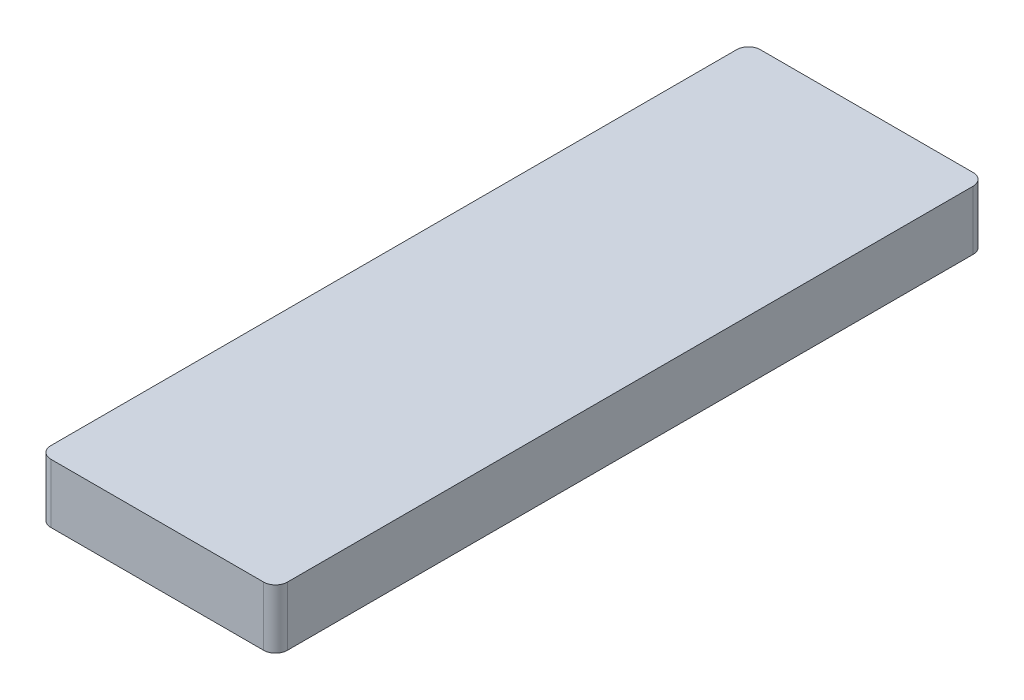
ISO-10303-21;
HEADER;
FILE_DESCRIPTION(('STEP AP214'),'2;1');
FILE_NAME('part.step','',(''),(''),'','','');
FILE_SCHEMA(('AUTOMOTIVE_DESIGN { 1 0 10303 214 1 1 1 1 }'));
ENDSEC;
DATA;
#1=APPLICATION_CONTEXT('core data for automotive mechanical design processes');
#2=APPLICATION_PROTOCOL_DEFINITION('international standard','automotive_design',2000,#1);
#3=PRODUCT_CONTEXT('',#1,'mechanical');
#4=PRODUCT('Part','Part','',(#3));
#5=PRODUCT_RELATED_PRODUCT_CATEGORY('part','',(#4));
#6=PRODUCT_DEFINITION_FORMATION('','',#4);
#7=PRODUCT_DEFINITION_CONTEXT('part definition',#1,'design');
#8=PRODUCT_DEFINITION('design','',#6,#7);
#9=PRODUCT_DEFINITION_SHAPE('','',#8);
#10=(LENGTH_UNIT() NAMED_UNIT(*) SI_UNIT(.MILLI.,.METRE.));
#11=(NAMED_UNIT(*) PLANE_ANGLE_UNIT() SI_UNIT($,.RADIAN.));
#12=(NAMED_UNIT(*) SI_UNIT($,.STERADIAN.) SOLID_ANGLE_UNIT());
#13=UNCERTAINTY_MEASURE_WITH_UNIT(LENGTH_MEASURE(1.E-05),#10,'distance_accuracy_value','');
#14=(GEOMETRIC_REPRESENTATION_CONTEXT(3) GLOBAL_UNCERTAINTY_ASSIGNED_CONTEXT((#13)) GLOBAL_UNIT_ASSIGNED_CONTEXT((#10,
#11,#12)) REPRESENTATION_CONTEXT('',''));
#15=CARTESIAN_POINT('',(0.,0.,0.));
#16=DIRECTION('',(0.,0.,1.));
#17=DIRECTION('',(1.,0.,0.));
#18=AXIS2_PLACEMENT_3D('',#15,#16,#17);
#19=CARTESIAN_POINT('',(48.26,12.7,-2.54));
#20=DIRECTION('',(0.,-1.,0.));
#21=DIRECTION('',(0.,0.,-1.));
#22=AXIS2_PLACEMENT_3D('',#19,#20,#21);
#23=CYLINDRICAL_SURFACE('',#22,2.54);
#24=CARTESIAN_POINT('',(48.26,0.,-2.54));
#25=DIRECTION('',(0.,1.,0.));
#26=DIRECTION('',(0.,0.,-1.));
#27=AXIS2_PLACEMENT_3D('',#24,#25,#26);
#28=CIRCLE('',#27,2.54);
#29=CARTESIAN_POINT('',(48.26,0.,0.));
#30=VERTEX_POINT('',#29);
#31=CARTESIAN_POINT('',(50.8,0.,-2.54000000000002));
#32=VERTEX_POINT('',#31);
#33=EDGE_CURVE('E129',#30,#32,#28,.T.);
#34=ORIENTED_EDGE('',*,*,#33,.T.);
#35=DIRECTION('',(0.,-1.,0.));
#36=VECTOR('',#35,1.);
#37=CARTESIAN_POINT('',(50.8,12.7,-2.54000000000002));
#38=LINE('',#37,#36);
#39=CARTESIAN_POINT('',(50.8,12.7,-2.54000000000002));
#40=VERTEX_POINT('',#39);
#41=EDGE_CURVE('E11',#40,#32,#38,.T.);
#42=ORIENTED_EDGE('',*,*,#41,.F.);
#43=CARTESIAN_POINT('',(48.26,12.7,-2.54));
#44=DIRECTION('',(0.,1.,0.));
#45=DIRECTION('',(0.,0.,-1.));
#46=AXIS2_PLACEMENT_3D('',#43,#44,#45);
#47=CIRCLE('',#46,2.54);
#48=CARTESIAN_POINT('',(48.26,12.7,0.));
#49=VERTEX_POINT('',#48);
#50=EDGE_CURVE('E143',#49,#40,#47,.T.);
#51=ORIENTED_EDGE('',*,*,#50,.F.);
#52=DIRECTION('',(0.,-1.,0.));
#53=VECTOR('',#52,1.);
#54=CARTESIAN_POINT('',(48.26,12.7,0.));
#55=LINE('',#54,#53);
#56=EDGE_CURVE('E125',#49,#30,#55,.T.);
#57=ORIENTED_EDGE('',*,*,#56,.T.);
#58=EDGE_LOOP('',(#34,#42,#51,#57));
#59=FACE_BOUND('',#58,.T.);
#60=ADVANCED_FACE('F33',(#59),#23,.T.);
#61=CARTESIAN_POINT('',(50.8,12.7,-2.54000000000002));
#62=DIRECTION('',(-1.,0.,0.));
#63=DIRECTION('',(0.,0.,1.));
#64=AXIS2_PLACEMENT_3D('',#61,#62,#63);
#65=PLANE('',#64);
#66=DIRECTION('',(0.,0.,-1.));
#67=VECTOR('',#66,1.);
#68=CARTESIAN_POINT('',(50.8,0.,-2.54000000000002));
#69=LINE('',#68,#67);
#70=CARTESIAN_POINT('',(50.8,0.,-149.86));
#71=VERTEX_POINT('',#70);
#72=EDGE_CURVE('E132',#32,#71,#69,.T.);
#73=ORIENTED_EDGE('',*,*,#72,.T.);
#74=DIRECTION('',(0.,-1.,0.));
#75=VECTOR('',#74,1.);
#76=CARTESIAN_POINT('',(50.8,12.7,-149.86));
#77=LINE('',#76,#75);
#78=CARTESIAN_POINT('',(50.8,12.7,-149.86));
#79=VERTEX_POINT('',#78);
#80=EDGE_CURVE('E41',#79,#71,#77,.T.);
#81=ORIENTED_EDGE('',*,*,#80,.F.);
#82=DIRECTION('',(0.,0.,-1.));
#83=VECTOR('',#82,1.);
#84=CARTESIAN_POINT('',(50.8,12.7,-2.54000000000002));
#85=LINE('',#84,#83);
#86=EDGE_CURVE('E92',#40,#79,#85,.T.);
#87=ORIENTED_EDGE('',*,*,#86,.F.);
#88=ORIENTED_EDGE('',*,*,#41,.T.);
#89=EDGE_LOOP('',(#73,#81,#87,#88));
#90=FACE_BOUND('',#89,.T.);
#91=ADVANCED_FACE('F178',(#90),#65,.F.);
#92=CARTESIAN_POINT('',(48.26,12.7,-149.86));
#93=DIRECTION('',(0.,-1.,0.));
#94=DIRECTION('',(0.,0.,-1.));
#95=AXIS2_PLACEMENT_3D('',#92,#93,#94);
#96=CYLINDRICAL_SURFACE('',#95,2.53999999999999);
#97=CARTESIAN_POINT('',(48.26,0.,-149.86));
#98=DIRECTION('',(0.,1.,0.));
#99=DIRECTION('',(0.,0.,1.));
#100=AXIS2_PLACEMENT_3D('',#97,#98,#99);
#101=CIRCLE('',#100,2.53999999999999);
#102=CARTESIAN_POINT('',(48.26,0.,-152.4));
#103=VERTEX_POINT('',#102);
#104=EDGE_CURVE('E134',#71,#103,#101,.T.);
#105=ORIENTED_EDGE('',*,*,#104,.T.);
#106=DIRECTION('',(0.,-1.,0.));
#107=VECTOR('',#106,1.);
#108=CARTESIAN_POINT('',(48.26,12.7,-152.4));
#109=LINE('',#108,#107);
#110=CARTESIAN_POINT('',(48.26,12.7,-152.4));
#111=VERTEX_POINT('',#110);
#112=EDGE_CURVE('E150',#111,#103,#109,.T.);
#113=ORIENTED_EDGE('',*,*,#112,.F.);
#114=CARTESIAN_POINT('',(48.26,12.7,-149.86));
#115=DIRECTION('',(0.,1.,0.));
#116=DIRECTION('',(0.,0.,1.));
#117=AXIS2_PLACEMENT_3D('',#114,#115,#116);
#118=CIRCLE('',#117,2.53999999999999);
#119=EDGE_CURVE('E158',#79,#111,#118,.T.);
#120=ORIENTED_EDGE('',*,*,#119,.F.);
#121=ORIENTED_EDGE('',*,*,#80,.T.);
#122=EDGE_LOOP('',(#105,#113,#120,#121));
#123=FACE_BOUND('',#122,.T.);
#124=ADVANCED_FACE('F156',(#123),#96,.T.);
#125=CARTESIAN_POINT('',(2.54000000000002,12.7,-152.4));
#126=DIRECTION('',(0.,0.,1.));
#127=DIRECTION('',(1.,0.,0.));
#128=AXIS2_PLACEMENT_3D('',#125,#126,#127);
#129=PLANE('',#128);
#130=DIRECTION('',(-1.,0.,0.));
#131=VECTOR('',#130,1.);
#132=CARTESIAN_POINT('',(2.54000000000002,0.,-152.4));
#133=LINE('',#132,#131);
#134=CARTESIAN_POINT('',(2.54000000000002,0.,-152.4));
#135=VERTEX_POINT('',#134);
#136=EDGE_CURVE('E136',#103,#135,#133,.T.);
#137=ORIENTED_EDGE('',*,*,#136,.T.);
#138=DIRECTION('',(0.,-1.,0.));
#139=VECTOR('',#138,1.);
#140=CARTESIAN_POINT('',(2.54000000000002,12.7,-152.4));
#141=LINE('',#140,#139);
#142=CARTESIAN_POINT('',(2.54000000000002,12.7,-152.4));
#143=VERTEX_POINT('',#142);
#144=EDGE_CURVE('E147',#143,#135,#141,.T.);
#145=ORIENTED_EDGE('',*,*,#144,.F.);
#146=DIRECTION('',(-1.,0.,0.));
#147=VECTOR('',#146,1.);
#148=CARTESIAN_POINT('',(2.54000000000002,12.7,-152.4));
#149=LINE('',#148,#147);
#150=EDGE_CURVE('E170',#111,#143,#149,.T.);
#151=ORIENTED_EDGE('',*,*,#150,.F.);
#152=ORIENTED_EDGE('',*,*,#112,.T.);
#153=EDGE_LOOP('',(#137,#145,#151,#152));
#154=FACE_BOUND('',#153,.T.);
#155=ADVANCED_FACE('F166',(#154),#129,.F.);
#156=CARTESIAN_POINT('',(2.54,12.7,-149.86));
#157=DIRECTION('',(0.,-1.,0.));
#158=DIRECTION('',(0.,0.,-1.));
#159=AXIS2_PLACEMENT_3D('',#156,#157,#158);
#160=CYLINDRICAL_SURFACE('',#159,2.53999999999999);
#161=CARTESIAN_POINT('',(2.54,0.,-149.86));
#162=DIRECTION('',(0.,1.,0.));
#163=DIRECTION('',(0.,0.,1.));
#164=AXIS2_PLACEMENT_3D('',#161,#162,#163);
#165=CIRCLE('',#164,2.53999999999999);
#166=CARTESIAN_POINT('',(0.,0.,-149.86));
#167=VERTEX_POINT('',#166);
#168=EDGE_CURVE('E138',#135,#167,#165,.T.);
#169=ORIENTED_EDGE('',*,*,#168,.T.);
#170=DIRECTION('',(0.,-1.,0.));
#171=VECTOR('',#170,1.);
#172=CARTESIAN_POINT('',(0.,12.7,-149.86));
#173=LINE('',#172,#171);
#174=CARTESIAN_POINT('',(0.,12.7,-149.86));
#175=VERTEX_POINT('',#174);
#176=EDGE_CURVE('E120',#175,#167,#173,.T.);
#177=ORIENTED_EDGE('',*,*,#176,.F.);
#178=CARTESIAN_POINT('',(2.54,12.7,-149.86));
#179=DIRECTION('',(0.,1.,0.));
#180=DIRECTION('',(0.,0.,1.));
#181=AXIS2_PLACEMENT_3D('',#178,#179,#180);
#182=CIRCLE('',#181,2.53999999999999);
#183=EDGE_CURVE('E111',#143,#175,#182,.T.);
#184=ORIENTED_EDGE('',*,*,#183,.F.);
#185=ORIENTED_EDGE('',*,*,#144,.T.);
#186=EDGE_LOOP('',(#169,#177,#184,#185));
#187=FACE_BOUND('',#186,.T.);
#188=ADVANCED_FACE('F169',(#187),#160,.T.);
#189=CARTESIAN_POINT('',(0.,12.7,-2.54000000000002));
#190=DIRECTION('',(1.,0.,0.));
#191=DIRECTION('',(0.,0.,-1.));
#192=AXIS2_PLACEMENT_3D('',#189,#190,#191);
#193=PLANE('',#192);
#194=DIRECTION('',(0.,0.,1.));
#195=VECTOR('',#194,1.);
#196=CARTESIAN_POINT('',(0.,0.,-2.54000000000002));
#197=LINE('',#196,#195);
#198=CARTESIAN_POINT('',(0.,0.,-2.54000000000002));
#199=VERTEX_POINT('',#198);
#200=EDGE_CURVE('E119',#167,#199,#197,.T.);
#201=ORIENTED_EDGE('',*,*,#200,.T.);
#202=DIRECTION('',(0.,-1.,0.));
#203=VECTOR('',#202,1.);
#204=CARTESIAN_POINT('',(0.,12.7,-2.54000000000002));
#205=LINE('',#204,#203);
#206=CARTESIAN_POINT('',(0.,12.7,-2.54000000000002));
#207=VERTEX_POINT('',#206);
#208=EDGE_CURVE('E116',#207,#199,#205,.T.);
#209=ORIENTED_EDGE('',*,*,#208,.F.);
#210=DIRECTION('',(0.,0.,1.));
#211=VECTOR('',#210,1.);
#212=CARTESIAN_POINT('',(0.,12.7,-2.54000000000002));
#213=LINE('',#212,#211);
#214=EDGE_CURVE('E105',#175,#207,#213,.T.);
#215=ORIENTED_EDGE('',*,*,#214,.F.);
#216=ORIENTED_EDGE('',*,*,#176,.T.);
#217=EDGE_LOOP('',(#201,#209,#215,#216));
#218=FACE_BOUND('',#217,.T.);
#219=ADVANCED_FACE('F117',(#218),#193,.F.);
#220=CARTESIAN_POINT('',(2.54,12.7,-2.54));
#221=DIRECTION('',(0.,-1.,0.));
#222=DIRECTION('',(0.,0.,-1.));
#223=AXIS2_PLACEMENT_3D('',#220,#221,#222);
#224=CYLINDRICAL_SURFACE('',#223,2.54);
#225=CARTESIAN_POINT('',(2.54,0.,-2.54));
#226=DIRECTION('',(0.,1.,0.));
#227=DIRECTION('',(0.,0.,1.));
#228=AXIS2_PLACEMENT_3D('',#225,#226,#227);
#229=CIRCLE('',#228,2.54);
#230=CARTESIAN_POINT('',(2.54000000000002,0.,0.));
#231=VERTEX_POINT('',#230);
#232=EDGE_CURVE('E78',#199,#231,#229,.T.);
#233=ORIENTED_EDGE('',*,*,#232,.T.);
#234=DIRECTION('',(0.,-1.,0.));
#235=VECTOR('',#234,1.);
#236=CARTESIAN_POINT('',(2.54000000000002,12.7,0.));
#237=LINE('',#236,#235);
#238=CARTESIAN_POINT('',(2.54000000000002,12.7,0.));
#239=VERTEX_POINT('',#238);
#240=EDGE_CURVE('E121',#239,#231,#237,.T.);
#241=ORIENTED_EDGE('',*,*,#240,.F.);
#242=CARTESIAN_POINT('',(2.54,12.7,-2.54));
#243=DIRECTION('',(0.,1.,0.));
#244=DIRECTION('',(0.,0.,1.));
#245=AXIS2_PLACEMENT_3D('',#242,#243,#244);
#246=CIRCLE('',#245,2.54);
#247=EDGE_CURVE('E109',#207,#239,#246,.T.);
#248=ORIENTED_EDGE('',*,*,#247,.F.);
#249=ORIENTED_EDGE('',*,*,#208,.T.);
#250=EDGE_LOOP('',(#233,#241,#248,#249));
#251=FACE_BOUND('',#250,.T.);
#252=ADVANCED_FACE('F123',(#251),#224,.T.);
#253=CARTESIAN_POINT('',(2.54000000000002,12.7,0.));
#254=DIRECTION('',(0.,0.,-1.));
#255=DIRECTION('',(-1.,0.,0.));
#256=AXIS2_PLACEMENT_3D('',#253,#254,#255);
#257=PLANE('',#256);
#258=DIRECTION('',(1.,0.,0.));
#259=VECTOR('',#258,1.);
#260=CARTESIAN_POINT('',(2.54000000000002,0.,0.));
#261=LINE('',#260,#259);
#262=EDGE_CURVE('E84',#231,#30,#261,.T.);
#263=ORIENTED_EDGE('',*,*,#262,.T.);
#264=ORIENTED_EDGE('',*,*,#56,.F.);
#265=DIRECTION('',(1.,0.,0.));
#266=VECTOR('',#265,1.);
#267=CARTESIAN_POINT('',(2.54000000000002,12.7,0.));
#268=LINE('',#267,#266);
#269=EDGE_CURVE('E49',#239,#49,#268,.T.);
#270=ORIENTED_EDGE('',*,*,#269,.F.);
#271=ORIENTED_EDGE('',*,*,#240,.T.);
#272=EDGE_LOOP('',(#263,#264,#270,#271));
#273=FACE_BOUND('',#272,.T.);
#274=ADVANCED_FACE('F194',(#273),#257,.F.);
#275=CARTESIAN_POINT('',(48.26,12.7,-2.54));
#276=DIRECTION('',(0.,-1.,0.));
#277=DIRECTION('',(0.,0.,-1.));
#278=AXIS2_PLACEMENT_3D('',#275,#276,#277);
#279=PLANE('',#278);
#280=ORIENTED_EDGE('',*,*,#50,.T.);
#281=ORIENTED_EDGE('',*,*,#86,.T.);
#282=ORIENTED_EDGE('',*,*,#119,.T.);
#283=ORIENTED_EDGE('',*,*,#150,.T.);
#284=ORIENTED_EDGE('',*,*,#183,.T.);
#285=ORIENTED_EDGE('',*,*,#214,.T.);
#286=ORIENTED_EDGE('',*,*,#247,.T.);
#287=ORIENTED_EDGE('',*,*,#269,.T.);
#288=EDGE_LOOP('',(#280,#281,#282,#283,#284,#285,#286,#287));
#289=FACE_BOUND('',#288,.T.);
#290=ADVANCED_FACE('F107',(#289),#279,.F.);
#291=CARTESIAN_POINT('',(48.26,0.,-2.54));
#292=DIRECTION('',(0.,-1.,0.));
#293=DIRECTION('',(0.,0.,-1.));
#294=AXIS2_PLACEMENT_3D('',#291,#292,#293);
#295=PLANE('',#294);
#296=ORIENTED_EDGE('',*,*,#33,.F.);
#297=ORIENTED_EDGE('',*,*,#262,.F.);
#298=ORIENTED_EDGE('',*,*,#232,.F.);
#299=ORIENTED_EDGE('',*,*,#200,.F.);
#300=ORIENTED_EDGE('',*,*,#168,.F.);
#301=ORIENTED_EDGE('',*,*,#136,.F.);
#302=ORIENTED_EDGE('',*,*,#104,.F.);
#303=ORIENTED_EDGE('',*,*,#72,.F.);
#304=EDGE_LOOP('',(#296,#297,#298,#299,#300,#301,#302,#303));
#305=FACE_BOUND('',#304,.T.);
#306=ADVANCED_FACE('F162',(#305),#295,.T.);
#307=CLOSED_SHELL('',(#60,#91,#124,#155,#188,#219,#252,#274,#290,#306));
#308=MANIFOLD_SOLID_BREP('B2',#307);
#309=ADVANCED_BREP_SHAPE_REPRESENTATION('',(#18,#308),#14);
#310=SHAPE_DEFINITION_REPRESENTATION(#9,#309);
ENDSEC;
END-ISO-10303-21;
